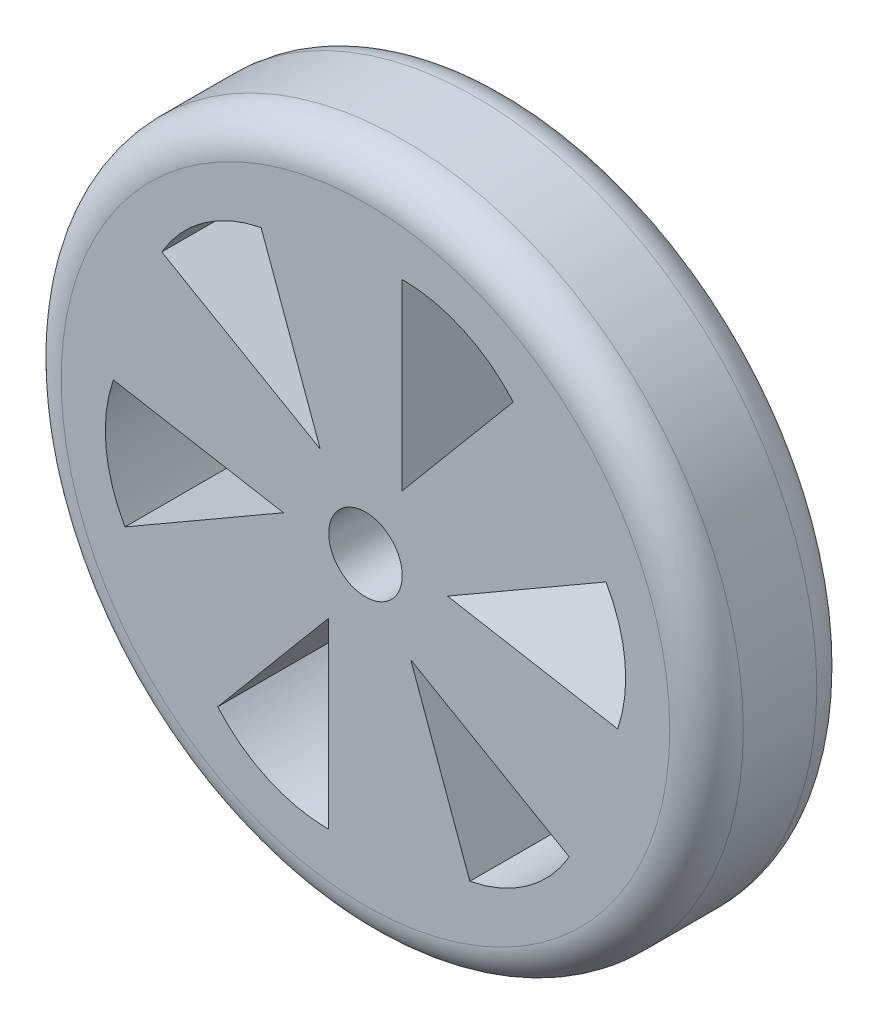
ISO-10303-21;
HEADER;
FILE_DESCRIPTION(('STEP AP214'),'2;1');
FILE_NAME('part.step','',(''),(''),'','','');
FILE_SCHEMA(('AUTOMOTIVE_DESIGN { 1 0 10303 214 1 1 1 1 }'));
ENDSEC;
DATA;
#1=APPLICATION_CONTEXT('core data for automotive mechanical design processes');
#2=APPLICATION_PROTOCOL_DEFINITION('international standard','automotive_design',2000,#1);
#3=PRODUCT_CONTEXT('',#1,'mechanical');
#4=PRODUCT('Part','Part','',(#3));
#5=PRODUCT_RELATED_PRODUCT_CATEGORY('part','',(#4));
#6=PRODUCT_DEFINITION_FORMATION('','',#4);
#7=PRODUCT_DEFINITION_CONTEXT('part definition',#1,'design');
#8=PRODUCT_DEFINITION('design','',#6,#7);
#9=PRODUCT_DEFINITION_SHAPE('','',#8);
#10=(LENGTH_UNIT() NAMED_UNIT(*) SI_UNIT(.MILLI.,.METRE.));
#11=(NAMED_UNIT(*) PLANE_ANGLE_UNIT() SI_UNIT($,.RADIAN.));
#12=(NAMED_UNIT(*) SI_UNIT($,.STERADIAN.) SOLID_ANGLE_UNIT());
#13=UNCERTAINTY_MEASURE_WITH_UNIT(LENGTH_MEASURE(1.E-05),#10,'distance_accuracy_value','');
#14=(GEOMETRIC_REPRESENTATION_CONTEXT(3) GLOBAL_UNCERTAINTY_ASSIGNED_CONTEXT((#13)) GLOBAL_UNIT_ASSIGNED_CONTEXT((#10,
#11,#12)) REPRESENTATION_CONTEXT('',''));
#15=CARTESIAN_POINT('',(0.,0.,0.));
#16=DIRECTION('',(0.,0.,1.));
#17=DIRECTION('',(1.,0.,0.));
#18=AXIS2_PLACEMENT_3D('',#15,#16,#17);
#19=CARTESIAN_POINT('',(0.,0.,20.));
#20=DIRECTION('',(0.,0.,-1.));
#21=DIRECTION('',(-1.,0.,0.));
#22=AXIS2_PLACEMENT_3D('',#19,#20,#21);
#23=CYLINDRICAL_SURFACE('',#22,46.3950945547595);
#24=CARTESIAN_POINT('',(0.,0.,5.));
#25=DIRECTION('',(0.,0.,1.));
#26=DIRECTION('',(1.,0.,0.));
#27=AXIS2_PLACEMENT_3D('',#24,#25,#26);
#28=CIRCLE('',#27,46.3950945547595);
#29=CARTESIAN_POINT('',(46.3950945547595,0.,5.));
#30=VERTEX_POINT('',#29);
#31=EDGE_CURVE('E415',#30,#30,#28,.T.);
#32=ORIENTED_EDGE('',*,*,#31,.T.);
#33=EDGE_LOOP('',(#32));
#34=FACE_BOUND('',#33,.T.);
#35=CARTESIAN_POINT('',(0.,0.,15.));
#36=DIRECTION('',(0.,0.,1.));
#37=DIRECTION('',(1.,0.,0.));
#38=AXIS2_PLACEMENT_3D('',#35,#36,#37);
#39=CIRCLE('',#38,46.3950945547595);
#40=CARTESIAN_POINT('',(46.3950945547595,0.,15.));
#41=VERTEX_POINT('',#40);
#42=EDGE_CURVE('E408',#41,#41,#39,.F.);
#43=ORIENTED_EDGE('',*,*,#42,.T.);
#44=EDGE_LOOP('',(#43));
#45=FACE_BOUND('',#44,.T.);
#46=ADVANCED_FACE('F76',(#34,#45),#23,.T.);
#47=CARTESIAN_POINT('',(0.,0.,20.));
#48=DIRECTION('',(0.,0.,1.));
#49=DIRECTION('',(1.,0.,0.));
#50=AXIS2_PLACEMENT_3D('',#47,#48,#49);
#51=PLANE('',#50);
#52=DIRECTION('',(0.86602540378444,0.499999999999998,0.));
#53=VECTOR('',#52,1.);
#54=CARTESIAN_POINT('',(11.1602540378444,0.669872981077783,20.));
#55=LINE('',#54,#53);
#56=CARTESIAN_POINT('',(11.1602540378444,0.669872981077783,20.));
#57=VERTEX_POINT('',#56);
#58=CARTESIAN_POINT('',(32.716545265148,13.1154035238914,20.));
#59=VERTEX_POINT('',#58);
#60=EDGE_CURVE('E257',#57,#59,#55,.T.);
#61=ORIENTED_EDGE('',*,*,#60,.T.);
#62=CARTESIAN_POINT('',(15.3960371894592,3.11540352389149,20.));
#63=DIRECTION('',(0.,0.,-1.));
#64=DIRECTION('',(-1.,0.,0.));
#65=AXIS2_PLACEMENT_3D('',#62,#63,#64);
#66=CIRCLE('',#65,20.);
#67=CARTESIAN_POINT('',(34.3013844921459,-3.41053268210982,20.));
#68=VERTEX_POINT('',#67);
#69=EDGE_CURVE('E92',#59,#68,#66,.T.);
#70=ORIENTED_EDGE('',*,*,#69,.T.);
#71=DIRECTION('',(-0.984807753012209,0.173648177666926,0.));
#72=VECTOR('',#71,1.);
#73=CARTESIAN_POINT('',(34.3013844921459,-3.41053268210982,20.));
#74=LINE('',#73,#72);
#75=EDGE_CURVE('E261',#68,#57,#74,.T.);
#76=ORIENTED_EDGE('',*,*,#75,.T.);
#77=EDGE_LOOP('',(#61,#70,#76));
#78=FACE_BOUND('',#77,.T.);
#79=DIRECTION('',(0.866025403784436,-0.500000000000004,0.));
#80=VECTOR('',#79,1.);
#81=CARTESIAN_POINT('',(6.16025403784435,-9.33012701892222,20.));
#82=LINE('',#81,#80);
#83=CARTESIAN_POINT('',(6.16025403784435,-9.33012701892222,20.));
#84=VERTEX_POINT('',#83);
#85=CARTESIAN_POINT('',(27.7165452651479,-21.775657561736,20.));
#86=VERTEX_POINT('',#85);
#87=EDGE_CURVE('E288',#84,#86,#82,.T.);
#88=ORIENTED_EDGE('',*,*,#87,.T.);
#89=CARTESIAN_POINT('',(10.3960371894592,-11.775657561736,20.));
#90=DIRECTION('',(0.,0.,-1.));
#91=DIRECTION('',(-1.,0.,0.));
#92=AXIS2_PLACEMENT_3D('',#89,#90,#91);
#93=CIRCLE('',#92,20.);
#94=CARTESIAN_POINT('',(14.1970843029287,-31.4111366962309,20.));
#95=VERTEX_POINT('',#94);
#96=EDGE_CURVE('E100',#86,#95,#93,.T.);
#97=ORIENTED_EDGE('',*,*,#96,.T.);
#98=DIRECTION('',(-0.34202014332567,0.939692620785908,0.));
#99=VECTOR('',#98,1.);
#100=CARTESIAN_POINT('',(14.1970843029287,-31.4111366962309,20.));
#101=LINE('',#100,#99);
#102=EDGE_CURVE('E292',#95,#84,#101,.T.);
#103=ORIENTED_EDGE('',*,*,#102,.T.);
#104=EDGE_LOOP('',(#88,#97,#103));
#105=FACE_BOUND('',#104,.T.);
#106=DIRECTION('',(-0.866025403784426,-0.500000000000022,0.));
#107=VECTOR('',#106,1.);
#108=CARTESIAN_POINT('',(-11.1602540378444,-0.669872981077703,20.));
#109=LINE('',#108,#107);
#110=CARTESIAN_POINT('',(-11.1602540378444,-0.669872981077703,20.));
#111=VERTEX_POINT('',#110);
#112=CARTESIAN_POINT('',(-32.7165452651477,-13.115403523892,20.));
#113=VERTEX_POINT('',#112);
#114=EDGE_CURVE('E318',#111,#113,#109,.T.);
#115=ORIENTED_EDGE('',*,*,#114,.T.);
#116=CARTESIAN_POINT('',(-15.3960371894593,-3.11540352389138,20.));
#117=DIRECTION('',(0.,0.,-1.));
#118=DIRECTION('',(-1.,0.,0.));
#119=AXIS2_PLACEMENT_3D('',#116,#117,#118);
#120=CIRCLE('',#119,19.9999999999998);
#121=CARTESIAN_POINT('',(-34.3013844921456,3.41053268210929,20.));
#122=VERTEX_POINT('',#121);
#123=EDGE_CURVE('E327',#113,#122,#120,.T.);
#124=ORIENTED_EDGE('',*,*,#123,.T.);
#125=DIRECTION('',(0.984807753012213,-0.173648177666904,0.));
#126=VECTOR('',#125,1.);
#127=CARTESIAN_POINT('',(-34.3013844921456,3.41053268210929,20.));
#128=LINE('',#127,#126);
#129=EDGE_CURVE('E322',#122,#111,#128,.T.);
#130=ORIENTED_EDGE('',*,*,#129,.T.);
#131=EDGE_LOOP('',(#115,#124,#130));
#132=FACE_BOUND('',#131,.T.);
#133=DIRECTION('',(0.,-1.,0.));
#134=VECTOR('',#133,1.);
#135=CARTESIAN_POINT('',(-5.00000000000007,-9.99999999999997,20.));
#136=LINE('',#135,#134);
#137=CARTESIAN_POINT('',(-5.00000000000007,-9.99999999999997,20.));
#138=VERTEX_POINT('',#137);
#139=CARTESIAN_POINT('',(-4.99999999999945,-34.8910610856277,20.));
#140=VERTEX_POINT('',#139);
#141=EDGE_CURVE('E351',#138,#140,#136,.T.);
#142=ORIENTED_EDGE('',*,*,#141,.T.);
#143=CARTESIAN_POINT('',(-5.0000000000001,-14.8910610856274,20.));
#144=DIRECTION('',(0.,0.,-1.));
#145=DIRECTION('',(-1.,0.,0.));
#146=AXIS2_PLACEMENT_3D('',#143,#144,#145);
#147=CIRCLE('',#146,20.);
#148=CARTESIAN_POINT('',(-20.1043001892165,-28.0006040141213,20.));
#149=VERTEX_POINT('',#148);
#150=EDGE_CURVE('E281',#140,#149,#147,.T.);
#151=ORIENTED_EDGE('',*,*,#150,.T.);
#152=DIRECTION('',(0.642787609686513,0.766044443119,0.));
#153=VECTOR('',#152,1.);
#154=CARTESIAN_POINT('',(-20.1043001892165,-28.0006040141213,20.));
#155=LINE('',#154,#153);
#156=EDGE_CURVE('E355',#149,#138,#155,.T.);
#157=ORIENTED_EDGE('',*,*,#156,.T.);
#158=EDGE_LOOP('',(#142,#151,#157));
#159=FACE_BOUND('',#158,.T.);
#160=DIRECTION('',(-0.866025403784433,0.50000000000001,0.));
#161=VECTOR('',#160,1.);
#162=CARTESIAN_POINT('',(-6.16025403784428,9.33012701892227,20.));
#163=LINE('',#162,#161);
#164=CARTESIAN_POINT('',(-6.16025403784428,9.33012701892227,20.));
#165=VERTEX_POINT('',#164);
#166=CARTESIAN_POINT('',(-27.7165452651478,21.7756575617362,20.));
#167=VERTEX_POINT('',#166);
#168=EDGE_CURVE('E222',#165,#167,#163,.T.);
#169=ORIENTED_EDGE('',*,*,#168,.T.);
#170=CARTESIAN_POINT('',(-10.3960371894591,11.775657561736,20.));
#171=DIRECTION('',(0.,0.,-1.));
#172=DIRECTION('',(-1.,0.,0.));
#173=AXIS2_PLACEMENT_3D('',#170,#171,#172);
#174=CIRCLE('',#173,20.);
#175=CARTESIAN_POINT('',(-14.1970843029285,31.411136696231,20.));
#176=VERTEX_POINT('',#175);
#177=EDGE_CURVE('E232',#167,#176,#174,.T.);
#178=ORIENTED_EDGE('',*,*,#177,.T.);
#179=DIRECTION('',(0.342020143325664,-0.93969262078591,0.));
#180=VECTOR('',#179,1.);
#181=CARTESIAN_POINT('',(-14.1970843029285,31.411136696231,20.));
#182=LINE('',#181,#180);
#183=EDGE_CURVE('E210',#176,#165,#182,.T.);
#184=ORIENTED_EDGE('',*,*,#183,.T.);
#185=EDGE_LOOP('',(#169,#178,#184));
#186=FACE_BOUND('',#185,.T.);
#187=CARTESIAN_POINT('',(5.,14.8910610856274,20.));
#188=DIRECTION('',(0.,0.,-1.));
#189=DIRECTION('',(-1.,0.,0.));
#190=AXIS2_PLACEMENT_3D('',#187,#188,#189);
#191=CIRCLE('',#190,20.);
#192=CARTESIAN_POINT('',(5.,34.8910610856274,20.));
#193=VERTEX_POINT('',#192);
#194=CARTESIAN_POINT('',(20.1043001892171,28.0006040141211,20.));
#195=VERTEX_POINT('',#194);
#196=EDGE_CURVE('E375',#193,#195,#191,.T.);
#197=ORIENTED_EDGE('',*,*,#196,.T.);
#198=DIRECTION('',(-0.642787609686535,-0.766044443118982,0.));
#199=VECTOR('',#198,1.);
#200=CARTESIAN_POINT('',(20.1043001892171,28.0006040141211,20.));
#201=LINE('',#200,#199);
#202=CARTESIAN_POINT('',(5.,10.,20.));
#203=VERTEX_POINT('',#202);
#204=EDGE_CURVE('E268',#195,#203,#201,.T.);
#205=ORIENTED_EDGE('',*,*,#204,.T.);
#206=DIRECTION('',(0.,1.,0.));
#207=VECTOR('',#206,1.);
#208=CARTESIAN_POINT('',(5.,10.,20.));
#209=LINE('',#208,#207);
#210=EDGE_CURVE('E386',#203,#193,#209,.T.);
#211=ORIENTED_EDGE('',*,*,#210,.T.);
#212=EDGE_LOOP('',(#197,#205,#211));
#213=FACE_BOUND('',#212,.T.);
#214=CARTESIAN_POINT('',(0.,0.,20.));
#215=DIRECTION('',(0.,0.,1.));
#216=DIRECTION('',(1.,0.,0.));
#217=AXIS2_PLACEMENT_3D('',#214,#215,#216);
#218=CIRCLE('',#217,5.);
#219=CARTESIAN_POINT('',(5.,0.,20.));
#220=VERTEX_POINT('',#219);
#221=EDGE_CURVE('E403',#220,#220,#218,.T.);
#222=ORIENTED_EDGE('',*,*,#221,.F.);
#223=EDGE_LOOP('',(#222));
#224=FACE_BOUND('',#223,.T.);
#225=CARTESIAN_POINT('',(0.,0.,20.));
#226=DIRECTION('',(0.,0.,1.));
#227=DIRECTION('',(1.,0.,0.));
#228=AXIS2_PLACEMENT_3D('',#225,#226,#227);
#229=CIRCLE('',#228,41.3950945547595);
#230=CARTESIAN_POINT('',(41.3950945547595,0.,20.));
#231=VERTEX_POINT('',#230);
#232=EDGE_CURVE('E12',#231,#231,#229,.T.);
#233=ORIENTED_EDGE('',*,*,#232,.T.);
#234=EDGE_LOOP('',(#233));
#235=FACE_BOUND('',#234,.T.);
#236=ADVANCED_FACE('F230',(#78,#105,#132,#159,#186,#213,#224,#235),#51,.T.);
#237=CARTESIAN_POINT('',(0.,0.,0.));
#238=DIRECTION('',(0.,0.,1.));
#239=DIRECTION('',(1.,0.,0.));
#240=AXIS2_PLACEMENT_3D('',#237,#238,#239);
#241=PLANE('',#240);
#242=CARTESIAN_POINT('',(15.3960371894592,3.11540352389149,0.));
#243=DIRECTION('',(0.,0.,-1.));
#244=DIRECTION('',(-1.,0.,0.));
#245=AXIS2_PLACEMENT_3D('',#242,#243,#244);
#246=CIRCLE('',#245,20.);
#247=CARTESIAN_POINT('',(32.716545265148,13.1154035238914,0.));
#248=VERTEX_POINT('',#247);
#249=CARTESIAN_POINT('',(34.3013844921459,-3.41053268210982,0.));
#250=VERTEX_POINT('',#249);
#251=EDGE_CURVE('E262',#248,#250,#246,.T.);
#252=ORIENTED_EDGE('',*,*,#251,.F.);
#253=DIRECTION('',(0.86602540378444,0.499999999999998,0.));
#254=VECTOR('',#253,1.);
#255=CARTESIAN_POINT('',(11.1602540378444,0.669872981077783,0.));
#256=LINE('',#255,#254);
#257=CARTESIAN_POINT('',(11.1602540378444,0.669872981077782,0.));
#258=VERTEX_POINT('',#257);
#259=EDGE_CURVE('E256',#258,#248,#256,.T.);
#260=ORIENTED_EDGE('',*,*,#259,.F.);
#261=DIRECTION('',(-0.984807753012209,0.173648177666926,0.));
#262=VECTOR('',#261,1.);
#263=CARTESIAN_POINT('',(34.3013844921459,-3.41053268210982,0.));
#264=LINE('',#263,#262);
#265=EDGE_CURVE('E271',#250,#258,#264,.T.);
#266=ORIENTED_EDGE('',*,*,#265,.F.);
#267=EDGE_LOOP('',(#252,#260,#266));
#268=FACE_BOUND('',#267,.T.);
#269=CARTESIAN_POINT('',(10.3960371894592,-11.775657561736,0.));
#270=DIRECTION('',(0.,0.,-1.));
#271=DIRECTION('',(-1.,0.,0.));
#272=AXIS2_PLACEMENT_3D('',#269,#270,#271);
#273=CIRCLE('',#272,20.);
#274=CARTESIAN_POINT('',(27.7165452651479,-21.775657561736,0.));
#275=VERTEX_POINT('',#274);
#276=CARTESIAN_POINT('',(14.1970843029287,-31.4111366962309,0.));
#277=VERTEX_POINT('',#276);
#278=EDGE_CURVE('E293',#275,#277,#273,.T.);
#279=ORIENTED_EDGE('',*,*,#278,.F.);
#280=DIRECTION('',(0.866025403784436,-0.500000000000004,0.));
#281=VECTOR('',#280,1.);
#282=CARTESIAN_POINT('',(6.16025403784435,-9.33012701892222,0.));
#283=LINE('',#282,#281);
#284=CARTESIAN_POINT('',(6.16025403784434,-9.33012701892222,0.));
#285=VERTEX_POINT('',#284);
#286=EDGE_CURVE('E287',#285,#275,#283,.T.);
#287=ORIENTED_EDGE('',*,*,#286,.F.);
#288=DIRECTION('',(-0.34202014332567,0.939692620785908,0.));
#289=VECTOR('',#288,1.);
#290=CARTESIAN_POINT('',(14.1970843029287,-31.4111366962309,0.));
#291=LINE('',#290,#289);
#292=EDGE_CURVE('E301',#277,#285,#291,.T.);
#293=ORIENTED_EDGE('',*,*,#292,.F.);
#294=EDGE_LOOP('',(#279,#287,#293));
#295=FACE_BOUND('',#294,.T.);
#296=CARTESIAN_POINT('',(-15.3960371894593,-3.11540352389138,0.));
#297=DIRECTION('',(0.,0.,-1.));
#298=DIRECTION('',(-1.,0.,0.));
#299=AXIS2_PLACEMENT_3D('',#296,#297,#298);
#300=CIRCLE('',#299,19.9999999999998);
#301=CARTESIAN_POINT('',(-32.7165452651477,-13.115403523892,0.));
#302=VERTEX_POINT('',#301);
#303=CARTESIAN_POINT('',(-34.3013844921456,3.41053268210929,0.));
#304=VERTEX_POINT('',#303);
#305=EDGE_CURVE('E323',#302,#304,#300,.T.);
#306=ORIENTED_EDGE('',*,*,#305,.F.);
#307=DIRECTION('',(-0.866025403784426,-0.500000000000022,0.));
#308=VECTOR('',#307,1.);
#309=CARTESIAN_POINT('',(-11.1602540378444,-0.669872981077703,0.));
#310=LINE('',#309,#308);
#311=CARTESIAN_POINT('',(-11.1602540378444,-0.669872981077703,0.));
#312=VERTEX_POINT('',#311);
#313=EDGE_CURVE('E317',#312,#302,#310,.T.);
#314=ORIENTED_EDGE('',*,*,#313,.F.);
#315=DIRECTION('',(0.984807753012213,-0.173648177666904,0.));
#316=VECTOR('',#315,1.);
#317=CARTESIAN_POINT('',(-34.3013844921456,3.41053268210929,0.));
#318=LINE('',#317,#316);
#319=EDGE_CURVE('E334',#304,#312,#318,.T.);
#320=ORIENTED_EDGE('',*,*,#319,.F.);
#321=EDGE_LOOP('',(#306,#314,#320));
#322=FACE_BOUND('',#321,.T.);
#323=CARTESIAN_POINT('',(-5.0000000000001,-14.8910610856274,0.));
#324=DIRECTION('',(0.,0.,-1.));
#325=DIRECTION('',(-1.,0.,0.));
#326=AXIS2_PLACEMENT_3D('',#323,#324,#325);
#327=CIRCLE('',#326,20.);
#328=CARTESIAN_POINT('',(-4.99999999999945,-34.8910610856277,0.));
#329=VERTEX_POINT('',#328);
#330=CARTESIAN_POINT('',(-20.1043001892165,-28.0006040141213,0.));
#331=VERTEX_POINT('',#330);
#332=EDGE_CURVE('E356',#329,#331,#327,.T.);
#333=ORIENTED_EDGE('',*,*,#332,.F.);
#334=DIRECTION('',(0.,-1.,0.));
#335=VECTOR('',#334,1.);
#336=CARTESIAN_POINT('',(-5.00000000000007,-9.99999999999997,0.));
#337=LINE('',#336,#335);
#338=CARTESIAN_POINT('',(-5.00000000000007,-9.99999999999997,0.));
#339=VERTEX_POINT('',#338);
#340=EDGE_CURVE('E350',#339,#329,#337,.T.);
#341=ORIENTED_EDGE('',*,*,#340,.F.);
#342=DIRECTION('',(0.642787609686513,0.766044443119,0.));
#343=VECTOR('',#342,1.);
#344=CARTESIAN_POINT('',(-20.1043001892165,-28.0006040141213,0.));
#345=LINE('',#344,#343);
#346=EDGE_CURVE('E365',#331,#339,#345,.T.);
#347=ORIENTED_EDGE('',*,*,#346,.F.);
#348=EDGE_LOOP('',(#333,#341,#347));
#349=FACE_BOUND('',#348,.T.);
#350=CARTESIAN_POINT('',(-10.3960371894591,11.775657561736,0.));
#351=DIRECTION('',(0.,0.,-1.));
#352=DIRECTION('',(-1.,0.,0.));
#353=AXIS2_PLACEMENT_3D('',#350,#351,#352);
#354=CIRCLE('',#353,20.);
#355=CARTESIAN_POINT('',(-27.7165452651478,21.7756575617362,0.));
#356=VERTEX_POINT('',#355);
#357=CARTESIAN_POINT('',(-14.1970843029285,31.411136696231,0.));
#358=VERTEX_POINT('',#357);
#359=EDGE_CURVE('E228',#356,#358,#354,.T.);
#360=ORIENTED_EDGE('',*,*,#359,.F.);
#361=DIRECTION('',(-0.866025403784433,0.50000000000001,0.));
#362=VECTOR('',#361,1.);
#363=CARTESIAN_POINT('',(-6.16025403784428,9.33012701892227,0.));
#364=LINE('',#363,#362);
#365=CARTESIAN_POINT('',(-6.16025403784428,9.33012701892226,0.));
#366=VERTEX_POINT('',#365);
#367=EDGE_CURVE('E240',#366,#356,#364,.T.);
#368=ORIENTED_EDGE('',*,*,#367,.F.);
#369=DIRECTION('',(0.342020143325664,-0.93969262078591,0.));
#370=VECTOR('',#369,1.);
#371=CARTESIAN_POINT('',(-14.1970843029285,31.411136696231,0.));
#372=LINE('',#371,#370);
#373=EDGE_CURVE('E213',#358,#366,#372,.T.);
#374=ORIENTED_EDGE('',*,*,#373,.F.);
#375=EDGE_LOOP('',(#360,#368,#374));
#376=FACE_BOUND('',#375,.T.);
#377=DIRECTION('',(-0.642787609686535,-0.766044443118982,0.));
#378=VECTOR('',#377,1.);
#379=CARTESIAN_POINT('',(20.1043001892171,28.0006040141211,0.));
#380=LINE('',#379,#378);
#381=CARTESIAN_POINT('',(20.1043001892171,28.0006040141211,0.));
#382=VERTEX_POINT('',#381);
#383=CARTESIAN_POINT('',(5.,10.,0.));
#384=VERTEX_POINT('',#383);
#385=EDGE_CURVE('E371',#382,#384,#380,.T.);
#386=ORIENTED_EDGE('',*,*,#385,.F.);
#387=CARTESIAN_POINT('',(5.,14.8910610856274,0.));
#388=DIRECTION('',(0.,0.,-1.));
#389=DIRECTION('',(-1.,0.,0.));
#390=AXIS2_PLACEMENT_3D('',#387,#388,#389);
#391=CIRCLE('',#390,20.);
#392=CARTESIAN_POINT('',(5.,34.8910610856274,0.));
#393=VERTEX_POINT('',#392);
#394=EDGE_CURVE('E379',#393,#382,#391,.T.);
#395=ORIENTED_EDGE('',*,*,#394,.F.);
#396=DIRECTION('',(0.,1.,0.));
#397=VECTOR('',#396,1.);
#398=CARTESIAN_POINT('',(5.,10.,0.));
#399=LINE('',#398,#397);
#400=EDGE_CURVE('E374',#384,#393,#399,.T.);
#401=ORIENTED_EDGE('',*,*,#400,.F.);
#402=EDGE_LOOP('',(#386,#395,#401));
#403=FACE_BOUND('',#402,.T.);
#404=CARTESIAN_POINT('',(0.,0.,0.));
#405=DIRECTION('',(0.,0.,1.));
#406=DIRECTION('',(1.,0.,0.));
#407=AXIS2_PLACEMENT_3D('',#404,#405,#406);
#408=CIRCLE('',#407,5.);
#409=CARTESIAN_POINT('',(5.,0.,0.));
#410=VERTEX_POINT('',#409);
#411=EDGE_CURVE('E404',#410,#410,#408,.T.);
#412=ORIENTED_EDGE('',*,*,#411,.T.);
#413=EDGE_LOOP('',(#412));
#414=FACE_BOUND('',#413,.T.);
#415=CARTESIAN_POINT('',(0.,0.,0.));
#416=DIRECTION('',(0.,0.,1.));
#417=DIRECTION('',(1.,0.,0.));
#418=AXIS2_PLACEMENT_3D('',#415,#416,#417);
#419=CIRCLE('',#418,41.3950945547595);
#420=CARTESIAN_POINT('',(41.3950945547595,0.,0.));
#421=VERTEX_POINT('',#420);
#422=EDGE_CURVE('E85',#421,#421,#419,.F.);
#423=ORIENTED_EDGE('',*,*,#422,.T.);
#424=EDGE_LOOP('',(#423));
#425=FACE_BOUND('',#424,.T.);
#426=ADVANCED_FACE('F422',(#268,#295,#322,#349,#376,#403,#414,#425),#241,.F.);
#427=CARTESIAN_POINT('',(0.,0.,5.));
#428=DIRECTION('',(0.,0.,1.));
#429=DIRECTION('',(1.,0.,0.));
#430=AXIS2_PLACEMENT_3D('',#427,#428,#429);
#431=TOROIDAL_SURFACE('',#430,41.3950945547595,5.);
#432=ORIENTED_EDGE('',*,*,#422,.F.);
#433=EDGE_LOOP('',(#432));
#434=FACE_BOUND('',#433,.T.);
#435=ORIENTED_EDGE('',*,*,#31,.F.);
#436=EDGE_LOOP('',(#435));
#437=FACE_BOUND('',#436,.T.);
#438=ADVANCED_FACE('F424',(#434,#437),#431,.T.);
#439=CARTESIAN_POINT('',(0.,0.,15.));
#440=DIRECTION('',(0.,0.,1.));
#441=DIRECTION('',(1.,0.,0.));
#442=AXIS2_PLACEMENT_3D('',#439,#440,#441);
#443=TOROIDAL_SURFACE('',#442,41.3950945547595,5.);
#444=ORIENTED_EDGE('',*,*,#42,.F.);
#445=EDGE_LOOP('',(#444));
#446=FACE_BOUND('',#445,.T.);
#447=ORIENTED_EDGE('',*,*,#232,.F.);
#448=EDGE_LOOP('',(#447));
#449=FACE_BOUND('',#448,.T.);
#450=ADVANCED_FACE('F78',(#446,#449),#443,.T.);
#451=CARTESIAN_POINT('',(0.,0.,0.));
#452=DIRECTION('',(0.,0.,1.));
#453=DIRECTION('',(1.,0.,0.));
#454=AXIS2_PLACEMENT_3D('',#451,#452,#453);
#455=CYLINDRICAL_SURFACE('',#454,5.);
#456=ORIENTED_EDGE('',*,*,#411,.F.);
#457=EDGE_LOOP('',(#456));
#458=FACE_BOUND('',#457,.T.);
#459=ORIENTED_EDGE('',*,*,#221,.T.);
#460=EDGE_LOOP('',(#459));
#461=FACE_BOUND('',#460,.T.);
#462=ADVANCED_FACE('F436',(#458,#461),#455,.F.);
#463=CARTESIAN_POINT('',(20.1043001892171,28.0006040141211,0.));
#464=DIRECTION('',(-0.766044443118982,0.642787609686535,0.));
#465=DIRECTION('',(-0.642787609686535,-0.766044443118982,0.));
#466=AXIS2_PLACEMENT_3D('',#463,#464,#465);
#467=PLANE('',#466);
#468=ORIENTED_EDGE('',*,*,#204,.F.);
#469=DIRECTION('',(0.,0.,1.));
#470=VECTOR('',#469,1.);
#471=CARTESIAN_POINT('',(20.1043001892171,28.0006040141211,0.));
#472=LINE('',#471,#470);
#473=EDGE_CURVE('E382',#382,#195,#472,.T.);
#474=ORIENTED_EDGE('',*,*,#473,.F.);
#475=ORIENTED_EDGE('',*,*,#385,.T.);
#476=DIRECTION('',(0.,0.,1.));
#477=VECTOR('',#476,1.);
#478=CARTESIAN_POINT('',(5.,10.,0.));
#479=LINE('',#478,#477);
#480=EDGE_CURVE('E399',#384,#203,#479,.T.);
#481=ORIENTED_EDGE('',*,*,#480,.T.);
#482=EDGE_LOOP('',(#468,#474,#475,#481));
#483=FACE_BOUND('',#482,.T.);
#484=ADVANCED_FACE('F451',(#483),#467,.T.);
#485=CARTESIAN_POINT('',(5.,10.,0.));
#486=DIRECTION('',(1.,0.,0.));
#487=DIRECTION('',(0.,1.,0.));
#488=AXIS2_PLACEMENT_3D('',#485,#486,#487);
#489=PLANE('',#488);
#490=ORIENTED_EDGE('',*,*,#210,.F.);
#491=ORIENTED_EDGE('',*,*,#480,.F.);
#492=ORIENTED_EDGE('',*,*,#400,.T.);
#493=DIRECTION('',(0.,0.,1.));
#494=VECTOR('',#493,1.);
#495=CARTESIAN_POINT('',(5.,34.8910610856274,0.));
#496=LINE('',#495,#494);
#497=EDGE_CURVE('E396',#393,#193,#496,.T.);
#498=ORIENTED_EDGE('',*,*,#497,.T.);
#499=EDGE_LOOP('',(#490,#491,#492,#498));
#500=FACE_BOUND('',#499,.T.);
#501=ADVANCED_FACE('F455',(#500),#489,.T.);
#502=CARTESIAN_POINT('',(5.,14.8910610856274,0.));
#503=DIRECTION('',(0.,0.,1.));
#504=DIRECTION('',(1.,0.,0.));
#505=AXIS2_PLACEMENT_3D('',#502,#503,#504);
#506=CYLINDRICAL_SURFACE('',#505,20.);
#507=ORIENTED_EDGE('',*,*,#196,.F.);
#508=ORIENTED_EDGE('',*,*,#497,.F.);
#509=ORIENTED_EDGE('',*,*,#394,.T.);
#510=ORIENTED_EDGE('',*,*,#473,.T.);
#511=EDGE_LOOP('',(#507,#508,#509,#510));
#512=FACE_BOUND('',#511,.T.);
#513=ADVANCED_FACE('F459',(#512),#506,.F.);
#514=CARTESIAN_POINT('',(-10.3960371894591,11.775657561736,0.));
#515=DIRECTION('',(0.,0.,1.));
#516=DIRECTION('',(1.,0.,0.));
#517=AXIS2_PLACEMENT_3D('',#514,#515,#516);
#518=CYLINDRICAL_SURFACE('',#517,20.);
#519=ORIENTED_EDGE('',*,*,#177,.F.);
#520=DIRECTION('',(0.,0.,1.));
#521=VECTOR('',#520,1.);
#522=CARTESIAN_POINT('',(-27.7165452651478,21.7756575617362,0.));
#523=LINE('',#522,#521);
#524=EDGE_CURVE('E217',#356,#167,#523,.T.);
#525=ORIENTED_EDGE('',*,*,#524,.F.);
#526=ORIENTED_EDGE('',*,*,#359,.T.);
#527=DIRECTION('',(0.,0.,1.));
#528=VECTOR('',#527,1.);
#529=CARTESIAN_POINT('',(-14.1970843029285,31.411136696231,0.));
#530=LINE('',#529,#528);
#531=EDGE_CURVE('E218',#358,#176,#530,.T.);
#532=ORIENTED_EDGE('',*,*,#531,.T.);
#533=EDGE_LOOP('',(#519,#525,#526,#532));
#534=FACE_BOUND('',#533,.T.);
#535=ADVANCED_FACE('F463',(#534),#518,.F.);
#536=CARTESIAN_POINT('',(-14.1970843029285,31.411136696231,0.));
#537=DIRECTION('',(-0.93969262078591,-0.342020143325664,0.));
#538=DIRECTION('',(0.342020143325664,-0.93969262078591,0.));
#539=AXIS2_PLACEMENT_3D('',#536,#537,#538);
#540=PLANE('',#539);
#541=ORIENTED_EDGE('',*,*,#183,.F.);
#542=ORIENTED_EDGE('',*,*,#531,.F.);
#543=ORIENTED_EDGE('',*,*,#373,.T.);
#544=DIRECTION('',(0.,0.,1.));
#545=VECTOR('',#544,1.);
#546=CARTESIAN_POINT('',(-6.16025403784428,9.33012701892227,0.));
#547=LINE('',#546,#545);
#548=EDGE_CURVE('E205',#366,#165,#547,.T.);
#549=ORIENTED_EDGE('',*,*,#548,.T.);
#550=EDGE_LOOP('',(#541,#542,#543,#549));
#551=FACE_BOUND('',#550,.T.);
#552=ADVANCED_FACE('F207',(#551),#540,.T.);
#553=CARTESIAN_POINT('',(-6.16025403784428,9.33012701892227,0.));
#554=DIRECTION('',(0.50000000000001,0.866025403784433,0.));
#555=DIRECTION('',(-0.866025403784433,0.50000000000001,0.));
#556=AXIS2_PLACEMENT_3D('',#553,#554,#555);
#557=PLANE('',#556);
#558=ORIENTED_EDGE('',*,*,#168,.F.);
#559=ORIENTED_EDGE('',*,*,#548,.F.);
#560=ORIENTED_EDGE('',*,*,#367,.T.);
#561=ORIENTED_EDGE('',*,*,#524,.T.);
#562=EDGE_LOOP('',(#558,#559,#560,#561));
#563=FACE_BOUND('',#562,.T.);
#564=ADVANCED_FACE('F223',(#563),#557,.T.);
#565=CARTESIAN_POINT('',(-5.0000000000001,-14.8910610856274,0.));
#566=DIRECTION('',(0.,0.,1.));
#567=DIRECTION('',(1.,0.,0.));
#568=AXIS2_PLACEMENT_3D('',#565,#566,#567);
#569=CYLINDRICAL_SURFACE('',#568,20.);
#570=ORIENTED_EDGE('',*,*,#150,.F.);
#571=DIRECTION('',(0.,0.,1.));
#572=VECTOR('',#571,1.);
#573=CARTESIAN_POINT('',(-4.99999999999945,-34.8910610856277,0.));
#574=LINE('',#573,#572);
#575=EDGE_CURVE('E346',#329,#140,#574,.T.);
#576=ORIENTED_EDGE('',*,*,#575,.F.);
#577=ORIENTED_EDGE('',*,*,#332,.T.);
#578=DIRECTION('',(0.,0.,1.));
#579=VECTOR('',#578,1.);
#580=CARTESIAN_POINT('',(-20.1043001892165,-28.0006040141213,0.));
#581=LINE('',#580,#579);
#582=EDGE_CURVE('E331',#331,#149,#581,.T.);
#583=ORIENTED_EDGE('',*,*,#582,.T.);
#584=EDGE_LOOP('',(#570,#576,#577,#583));
#585=FACE_BOUND('',#584,.T.);
#586=ADVANCED_FACE('F473',(#585),#569,.F.);
#587=CARTESIAN_POINT('',(-20.1043001892165,-28.0006040141213,0.));
#588=DIRECTION('',(0.766044443119,-0.642787609686513,0.));
#589=DIRECTION('',(0.642787609686513,0.766044443119,0.));
#590=AXIS2_PLACEMENT_3D('',#587,#588,#589);
#591=PLANE('',#590);
#592=ORIENTED_EDGE('',*,*,#156,.F.);
#593=ORIENTED_EDGE('',*,*,#582,.F.);
#594=ORIENTED_EDGE('',*,*,#346,.T.);
#595=DIRECTION('',(0.,0.,1.));
#596=VECTOR('',#595,1.);
#597=CARTESIAN_POINT('',(-5.00000000000007,-9.99999999999997,0.));
#598=LINE('',#597,#596);
#599=EDGE_CURVE('E343',#339,#138,#598,.T.);
#600=ORIENTED_EDGE('',*,*,#599,.T.);
#601=EDGE_LOOP('',(#592,#593,#594,#600));
#602=FACE_BOUND('',#601,.T.);
#603=ADVANCED_FACE('F469',(#602),#591,.T.);
#604=CARTESIAN_POINT('',(-5.00000000000007,-9.99999999999997,0.));
#605=DIRECTION('',(-1.,0.,0.));
#606=DIRECTION('',(0.,-1.,0.));
#607=AXIS2_PLACEMENT_3D('',#604,#605,#606);
#608=PLANE('',#607);
#609=ORIENTED_EDGE('',*,*,#141,.F.);
#610=ORIENTED_EDGE('',*,*,#599,.F.);
#611=ORIENTED_EDGE('',*,*,#340,.T.);
#612=ORIENTED_EDGE('',*,*,#575,.T.);
#613=EDGE_LOOP('',(#609,#610,#611,#612));
#614=FACE_BOUND('',#613,.T.);
#615=ADVANCED_FACE('F465',(#614),#608,.T.);
#616=CARTESIAN_POINT('',(-15.3960371894593,-3.11540352389138,0.));
#617=DIRECTION('',(0.,0.,1.));
#618=DIRECTION('',(1.,0.,0.));
#619=AXIS2_PLACEMENT_3D('',#616,#617,#618);
#620=CYLINDRICAL_SURFACE('',#619,19.9999999999998);
#621=ORIENTED_EDGE('',*,*,#123,.F.);
#622=DIRECTION('',(0.,0.,1.));
#623=VECTOR('',#622,1.);
#624=CARTESIAN_POINT('',(-32.7165452651477,-13.115403523892,0.));
#625=LINE('',#624,#623);
#626=EDGE_CURVE('E313',#302,#113,#625,.T.);
#627=ORIENTED_EDGE('',*,*,#626,.F.);
#628=ORIENTED_EDGE('',*,*,#305,.T.);
#629=DIRECTION('',(0.,0.,1.));
#630=VECTOR('',#629,1.);
#631=CARTESIAN_POINT('',(-34.3013844921456,3.41053268210929,0.));
#632=LINE('',#631,#630);
#633=EDGE_CURVE('E236',#304,#122,#632,.T.);
#634=ORIENTED_EDGE('',*,*,#633,.T.);
#635=EDGE_LOOP('',(#621,#627,#628,#634));
#636=FACE_BOUND('',#635,.T.);
#637=ADVANCED_FACE('F468',(#636),#620,.F.);
#638=CARTESIAN_POINT('',(-34.3013844921456,3.41053268210929,0.));
#639=DIRECTION('',(-0.173648177666904,-0.984807753012213,0.));
#640=DIRECTION('',(0.984807753012213,-0.173648177666904,0.));
#641=AXIS2_PLACEMENT_3D('',#638,#639,#640);
#642=PLANE('',#641);
#643=ORIENTED_EDGE('',*,*,#129,.F.);
#644=ORIENTED_EDGE('',*,*,#633,.F.);
#645=ORIENTED_EDGE('',*,*,#319,.T.);
#646=DIRECTION('',(0.,0.,1.));
#647=VECTOR('',#646,1.);
#648=CARTESIAN_POINT('',(-11.1602540378444,-0.669872981077703,0.));
#649=LINE('',#648,#647);
#650=EDGE_CURVE('E310',#312,#111,#649,.T.);
#651=ORIENTED_EDGE('',*,*,#650,.T.);
#652=EDGE_LOOP('',(#643,#644,#645,#651));
#653=FACE_BOUND('',#652,.T.);
#654=ADVANCED_FACE('F482',(#653),#642,.T.);
#655=CARTESIAN_POINT('',(-11.1602540378444,-0.669872981077703,0.));
#656=DIRECTION('',(-0.500000000000022,0.866025403784426,0.));
#657=DIRECTION('',(-0.866025403784426,-0.500000000000022,0.));
#658=AXIS2_PLACEMENT_3D('',#655,#656,#657);
#659=PLANE('',#658);
#660=ORIENTED_EDGE('',*,*,#114,.F.);
#661=ORIENTED_EDGE('',*,*,#650,.F.);
#662=ORIENTED_EDGE('',*,*,#313,.T.);
#663=ORIENTED_EDGE('',*,*,#626,.T.);
#664=EDGE_LOOP('',(#660,#661,#662,#663));
#665=FACE_BOUND('',#664,.T.);
#666=ADVANCED_FACE('F478',(#665),#659,.T.);
#667=CARTESIAN_POINT('',(10.3960371894592,-11.775657561736,0.));
#668=DIRECTION('',(0.,0.,1.));
#669=DIRECTION('',(1.,0.,0.));
#670=AXIS2_PLACEMENT_3D('',#667,#668,#669);
#671=CYLINDRICAL_SURFACE('',#670,20.);
#672=ORIENTED_EDGE('',*,*,#96,.F.);
#673=DIRECTION('',(0.,0.,1.));
#674=VECTOR('',#673,1.);
#675=CARTESIAN_POINT('',(27.7165452651479,-21.775657561736,0.));
#676=LINE('',#675,#674);
#677=EDGE_CURVE('E284',#275,#86,#676,.T.);
#678=ORIENTED_EDGE('',*,*,#677,.F.);
#679=ORIENTED_EDGE('',*,*,#278,.T.);
#680=DIRECTION('',(0.,0.,1.));
#681=VECTOR('',#680,1.);
#682=CARTESIAN_POINT('',(14.1970843029287,-31.4111366962309,0.));
#683=LINE('',#682,#681);
#684=EDGE_CURVE('E277',#277,#95,#683,.T.);
#685=ORIENTED_EDGE('',*,*,#684,.T.);
#686=EDGE_LOOP('',(#672,#678,#679,#685));
#687=FACE_BOUND('',#686,.T.);
#688=ADVANCED_FACE('F481',(#687),#671,.F.);
#689=CARTESIAN_POINT('',(14.1970843029287,-31.4111366962309,0.));
#690=DIRECTION('',(0.939692620785908,0.34202014332567,0.));
#691=DIRECTION('',(-0.34202014332567,0.939692620785908,0.));
#692=AXIS2_PLACEMENT_3D('',#689,#690,#691);
#693=PLANE('',#692);
#694=ORIENTED_EDGE('',*,*,#102,.F.);
#695=ORIENTED_EDGE('',*,*,#684,.F.);
#696=ORIENTED_EDGE('',*,*,#292,.T.);
#697=DIRECTION('',(0.,0.,1.));
#698=VECTOR('',#697,1.);
#699=CARTESIAN_POINT('',(6.16025403784435,-9.33012701892222,0.));
#700=LINE('',#699,#698);
#701=EDGE_CURVE('E280',#285,#84,#700,.T.);
#702=ORIENTED_EDGE('',*,*,#701,.T.);
#703=EDGE_LOOP('',(#694,#695,#696,#702));
#704=FACE_BOUND('',#703,.T.);
#705=ADVANCED_FACE('F494',(#704),#693,.T.);
#706=CARTESIAN_POINT('',(6.16025403784435,-9.33012701892222,0.));
#707=DIRECTION('',(-0.500000000000004,-0.866025403784436,0.));
#708=DIRECTION('',(0.866025403784436,-0.500000000000004,0.));
#709=AXIS2_PLACEMENT_3D('',#706,#707,#708);
#710=PLANE('',#709);
#711=ORIENTED_EDGE('',*,*,#87,.F.);
#712=ORIENTED_EDGE('',*,*,#701,.F.);
#713=ORIENTED_EDGE('',*,*,#286,.T.);
#714=ORIENTED_EDGE('',*,*,#677,.T.);
#715=EDGE_LOOP('',(#711,#712,#713,#714));
#716=FACE_BOUND('',#715,.T.);
#717=ADVANCED_FACE('F490',(#716),#710,.T.);
#718=CARTESIAN_POINT('',(15.3960371894592,3.11540352389149,0.));
#719=DIRECTION('',(0.,0.,1.));
#720=DIRECTION('',(1.,0.,0.));
#721=AXIS2_PLACEMENT_3D('',#718,#719,#720);
#722=CYLINDRICAL_SURFACE('',#721,20.);
#723=ORIENTED_EDGE('',*,*,#69,.F.);
#724=DIRECTION('',(0.,0.,1.));
#725=VECTOR('',#724,1.);
#726=CARTESIAN_POINT('',(32.716545265148,13.1154035238914,0.));
#727=LINE('',#726,#725);
#728=EDGE_CURVE('E253',#248,#59,#727,.T.);
#729=ORIENTED_EDGE('',*,*,#728,.F.);
#730=ORIENTED_EDGE('',*,*,#251,.T.);
#731=DIRECTION('',(0.,0.,1.));
#732=VECTOR('',#731,1.);
#733=CARTESIAN_POINT('',(34.3013844921459,-3.41053268210982,0.));
#734=LINE('',#733,#732);
#735=EDGE_CURVE('E247',#250,#68,#734,.T.);
#736=ORIENTED_EDGE('',*,*,#735,.T.);
#737=EDGE_LOOP('',(#723,#729,#730,#736));
#738=FACE_BOUND('',#737,.T.);
#739=ADVANCED_FACE('F493',(#738),#722,.F.);
#740=CARTESIAN_POINT('',(34.3013844921459,-3.41053268210982,0.));
#741=DIRECTION('',(0.173648177666926,0.984807753012209,0.));
#742=DIRECTION('',(-0.984807753012209,0.173648177666927,0.));
#743=AXIS2_PLACEMENT_3D('',#740,#741,#742);
#744=PLANE('',#743);
#745=ORIENTED_EDGE('',*,*,#75,.F.);
#746=ORIENTED_EDGE('',*,*,#735,.F.);
#747=ORIENTED_EDGE('',*,*,#265,.T.);
#748=DIRECTION('',(0.,0.,1.));
#749=VECTOR('',#748,1.);
#750=CARTESIAN_POINT('',(11.1602540378444,0.669872981077783,0.));
#751=LINE('',#750,#749);
#752=EDGE_CURVE('E250',#258,#57,#751,.T.);
#753=ORIENTED_EDGE('',*,*,#752,.T.);
#754=EDGE_LOOP('',(#745,#746,#747,#753));
#755=FACE_BOUND('',#754,.T.);
#756=ADVANCED_FACE('F504',(#755),#744,.T.);
#757=CARTESIAN_POINT('',(11.1602540378444,0.669872981077783,0.));
#758=DIRECTION('',(0.499999999999998,-0.86602540378444,0.));
#759=DIRECTION('',(0.86602540378444,0.499999999999998,0.));
#760=AXIS2_PLACEMENT_3D('',#757,#758,#759);
#761=PLANE('',#760);
#762=ORIENTED_EDGE('',*,*,#60,.F.);
#763=ORIENTED_EDGE('',*,*,#752,.F.);
#764=ORIENTED_EDGE('',*,*,#259,.T.);
#765=ORIENTED_EDGE('',*,*,#728,.T.);
#766=EDGE_LOOP('',(#762,#763,#764,#765));
#767=FACE_BOUND('',#766,.T.);
#768=ADVANCED_FACE('F501',(#767),#761,.T.);
#769=CLOSED_SHELL('',(#46,#236,#426,#438,#450,#462,#484,#501,#513,#535,#552,#564,#586,#603,#615,
#637,#654,#666,#688,#705,#717,#739,#756,#768));
#770=MANIFOLD_SOLID_BREP('B2',#769);
#771=ADVANCED_BREP_SHAPE_REPRESENTATION('',(#18,#770),#14);
#772=SHAPE_DEFINITION_REPRESENTATION(#9,#771);
ENDSEC;
END-ISO-10303-21;
